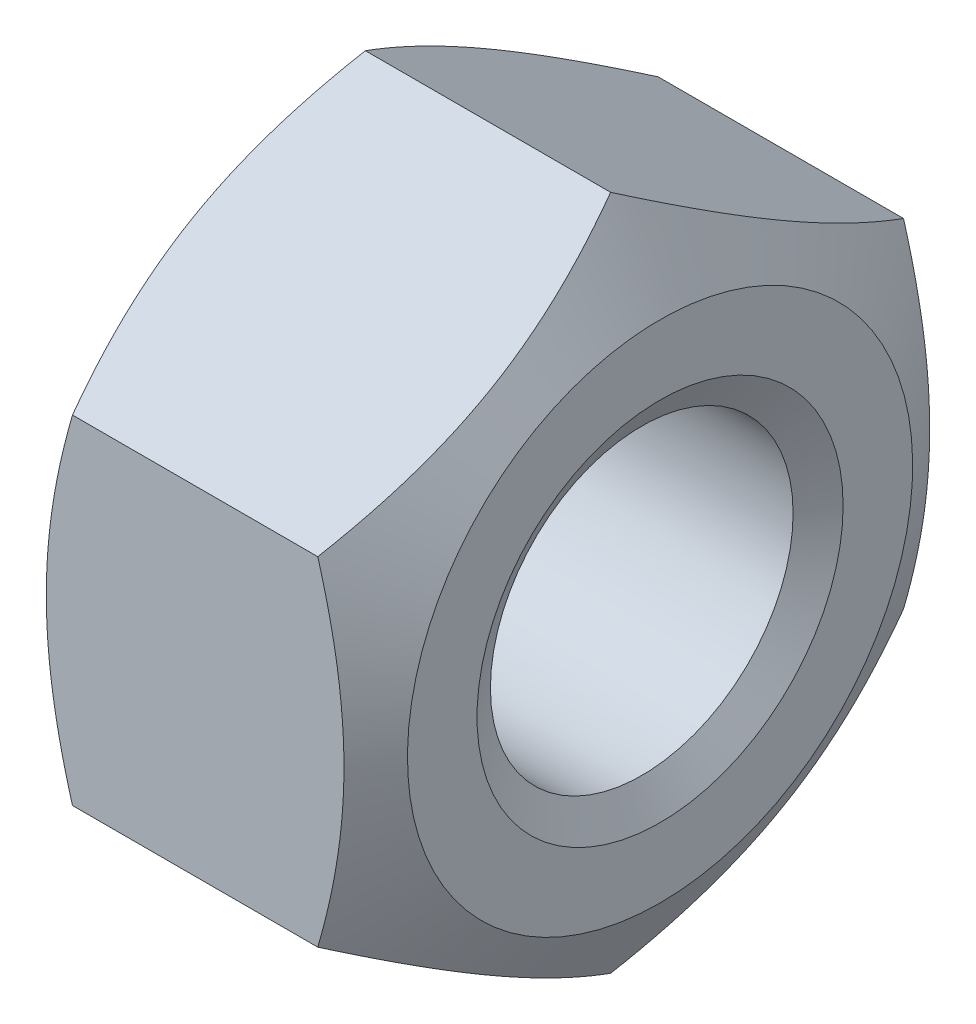
ISO-10303-21;
HEADER;
FILE_DESCRIPTION(('STEP AP214'),'2;1');
FILE_NAME('part.step','',(''),(''),'','','');
FILE_SCHEMA(('AUTOMOTIVE_DESIGN { 1 0 10303 214 1 1 1 1 }'));
ENDSEC;
DATA;
#1=APPLICATION_CONTEXT('core data for automotive mechanical design processes');
#2=APPLICATION_PROTOCOL_DEFINITION('international standard','automotive_design',2000,#1);
#3=PRODUCT_CONTEXT('',#1,'mechanical');
#4=PRODUCT('Part','Part','',(#3));
#5=PRODUCT_RELATED_PRODUCT_CATEGORY('part','',(#4));
#6=PRODUCT_DEFINITION_FORMATION('','',#4);
#7=PRODUCT_DEFINITION_CONTEXT('part definition',#1,'design');
#8=PRODUCT_DEFINITION('design','',#6,#7);
#9=PRODUCT_DEFINITION_SHAPE('','',#8);
#10=(LENGTH_UNIT() NAMED_UNIT(*) SI_UNIT(.MILLI.,.METRE.));
#11=(NAMED_UNIT(*) PLANE_ANGLE_UNIT() SI_UNIT($,.RADIAN.));
#12=(NAMED_UNIT(*) SI_UNIT($,.STERADIAN.) SOLID_ANGLE_UNIT());
#13=UNCERTAINTY_MEASURE_WITH_UNIT(LENGTH_MEASURE(1.E-05),#10,'distance_accuracy_value','');
#14=(GEOMETRIC_REPRESENTATION_CONTEXT(3) GLOBAL_UNCERTAINTY_ASSIGNED_CONTEXT((#13)) GLOBAL_UNIT_ASSIGNED_CONTEXT((#10,
#11,#12)) REPRESENTATION_CONTEXT('',''));
#15=CARTESIAN_POINT('',(0.,0.,0.));
#16=DIRECTION('',(0.,0.,1.));
#17=DIRECTION('',(1.,0.,0.));
#18=AXIS2_PLACEMENT_3D('',#15,#16,#17);
#19=CARTESIAN_POINT('',(0.,-4.61880215351701,0.));
#20=DIRECTION('',(0.,-0.866025403784439,0.5));
#21=DIRECTION('',(-1.,0.,0.));
#22=AXIS2_PLACEMENT_3D('',#19,#20,#21);
#23=PLANE('',#22);
#24=CARTESIAN_POINT('',(0.674808237962457,-2.30940107675851,4.));
#25=CARTESIAN_POINT('',(0.00814157129579357,-3.46410161513776,2.));
#26=CARTESIAN_POINT('',(0.674808237962457,-4.61880215351701,0.));
#27=(BOUNDED_CURVE() B_SPLINE_CURVE(2,(#24,#25,#26),.UNSPECIFIED.,.F.,
.F.) B_SPLINE_CURVE_WITH_KNOTS((3,3),(0.,0.467374455231166),
.UNSPECIFIED.) CURVE() GEOMETRIC_REPRESENTATION_ITEM() RATIONAL_B_SPLINE_CURVE((1.,
1.15470053837925,1.)) REPRESENTATION_ITEM(''));
#28=CARTESIAN_POINT('',(0.674808237962457,-2.3094010767585,4.));
#29=VERTEX_POINT('',#28);
#30=CARTESIAN_POINT('',(0.674808237962457,-4.61880215351701,0.));
#31=VERTEX_POINT('',#30);
#32=EDGE_CURVE('E158',#29,#31,#27,.T.);
#33=ORIENTED_EDGE('',*,*,#32,.T.);
#34=DIRECTION('',(1.,0.,0.));
#35=VECTOR('',#34,1.);
#36=CARTESIAN_POINT('',(0.,-4.61880215351701,0.));
#37=LINE('',#36,#35);
#38=CARTESIAN_POINT('',(4.02519176203754,-4.61880215351701,0.));
#39=VERTEX_POINT('',#38);
#40=EDGE_CURVE('E11',#31,#39,#37,.T.);
#41=ORIENTED_EDGE('',*,*,#40,.T.);
#42=CARTESIAN_POINT('',(4.02519176203754,-4.61880215351701,0.));
#43=CARTESIAN_POINT('',(4.69185842870421,-3.46410161513776,2.));
#44=CARTESIAN_POINT('',(4.02519176203754,-2.30940107675851,4.));
#45=(BOUNDED_CURVE() B_SPLINE_CURVE(2,(#42,#43,#44),.UNSPECIFIED.,.F.,
.F.) B_SPLINE_CURVE_WITH_KNOTS((3,3),(0.,0.467374455231167),
.UNSPECIFIED.) CURVE() GEOMETRIC_REPRESENTATION_ITEM() RATIONAL_B_SPLINE_CURVE((1.,
1.15470053837925,1.)) REPRESENTATION_ITEM(''));
#46=CARTESIAN_POINT('',(4.02519176203754,-2.3094010767585,4.));
#47=VERTEX_POINT('',#46);
#48=EDGE_CURVE('E238',#39,#47,#45,.T.);
#49=ORIENTED_EDGE('',*,*,#48,.T.);
#50=DIRECTION('',(1.,0.,0.));
#51=VECTOR('',#50,1.);
#52=CARTESIAN_POINT('',(0.,-2.3094010767585,4.));
#53=LINE('',#52,#51);
#54=EDGE_CURVE('E27',#29,#47,#53,.T.);
#55=ORIENTED_EDGE('',*,*,#54,.F.);
#56=EDGE_LOOP('',(#33,#41,#49,#55));
#57=FACE_BOUND('',#56,.T.);
#58=ADVANCED_FACE('F17',(#57),#23,.T.);
#59=CARTESIAN_POINT('',(0.,-2.30940107675849,-4.));
#60=DIRECTION('',(0.,-0.866025403784439,-0.5));
#61=DIRECTION('',(0.,0.5,-0.866025403784439));
#62=AXIS2_PLACEMENT_3D('',#59,#60,#61);
#63=PLANE('',#62);
#64=CARTESIAN_POINT('',(0.674808237962457,-4.61880215351701,0.));
#65=CARTESIAN_POINT('',(0.0081415712957876,-3.46410161513776,-2.));
#66=CARTESIAN_POINT('',(0.674808237962457,-2.3094010767585,-4.));
#67=(BOUNDED_CURVE() B_SPLINE_CURVE(2,(#64,#65,#66),.UNSPECIFIED.,.F.,
.F.) B_SPLINE_CURVE_WITH_KNOTS((3,3),(0.,0.467374455231168),
.UNSPECIFIED.) CURVE() GEOMETRIC_REPRESENTATION_ITEM() RATIONAL_B_SPLINE_CURVE((1.,
1.15470053837925,1.)) REPRESENTATION_ITEM(''));
#68=CARTESIAN_POINT('',(0.674808237962457,-2.30940107675849,-4.));
#69=VERTEX_POINT('',#68);
#70=EDGE_CURVE('E157',#31,#69,#67,.T.);
#71=ORIENTED_EDGE('',*,*,#70,.T.);
#72=DIRECTION('',(1.,0.,0.));
#73=VECTOR('',#72,1.);
#74=CARTESIAN_POINT('',(0.,-2.30940107675849,-4.));
#75=LINE('',#74,#73);
#76=CARTESIAN_POINT('',(4.02519176203754,-2.30940107675849,-4.));
#77=VERTEX_POINT('',#76);
#78=EDGE_CURVE('E254',#69,#77,#75,.T.);
#79=ORIENTED_EDGE('',*,*,#78,.T.);
#80=CARTESIAN_POINT('',(4.02519176203754,-2.30940107675849,-4.));
#81=CARTESIAN_POINT('',(4.69185842870421,-3.46410161513776,-2.));
#82=CARTESIAN_POINT('',(4.02519176203754,-4.61880215351701,0.));
#83=(BOUNDED_CURVE() B_SPLINE_CURVE(2,(#80,#81,#82),.UNSPECIFIED.,.F.,
.F.) B_SPLINE_CURVE_WITH_KNOTS((3,3),(0.,0.467374455231169),
.UNSPECIFIED.) CURVE() GEOMETRIC_REPRESENTATION_ITEM() RATIONAL_B_SPLINE_CURVE((1.,
1.15470053837925,1.)) REPRESENTATION_ITEM(''));
#84=EDGE_CURVE('E196',#77,#39,#83,.T.);
#85=ORIENTED_EDGE('',*,*,#84,.T.);
#86=ORIENTED_EDGE('',*,*,#40,.F.);
#87=EDGE_LOOP('',(#71,#79,#85,#86));
#88=FACE_BOUND('',#87,.T.);
#89=ADVANCED_FACE('F394',(#88),#63,.T.);
#90=CARTESIAN_POINT('',(0.,-2.3094010767585,4.));
#91=DIRECTION('',(0.,0.,1.));
#92=DIRECTION('',(1.,0.,0.));
#93=AXIS2_PLACEMENT_3D('',#90,#91,#92);
#94=PLANE('',#93);
#95=CARTESIAN_POINT('',(0.674808237962457,2.3094010767585,4.));
#96=CARTESIAN_POINT('',(0.00814157129579468,0.,4.));
#97=CARTESIAN_POINT('',(0.674808237962457,-2.3094010767585,4.));
#98=(BOUNDED_CURVE() B_SPLINE_CURVE(2,(#95,#96,#97),.UNSPECIFIED.,.F.,
.F.) B_SPLINE_CURVE_WITH_KNOTS((3,3),(0.,0.467374455231166),
.UNSPECIFIED.) CURVE() GEOMETRIC_REPRESENTATION_ITEM() RATIONAL_B_SPLINE_CURVE((1.,
1.15470053837925,1.)) REPRESENTATION_ITEM(''));
#99=CARTESIAN_POINT('',(0.674808237962457,2.3094010767585,4.));
#100=VERTEX_POINT('',#99);
#101=EDGE_CURVE('E153',#100,#29,#98,.T.);
#102=ORIENTED_EDGE('',*,*,#101,.T.);
#103=ORIENTED_EDGE('',*,*,#54,.T.);
#104=CARTESIAN_POINT('',(4.02519176203754,-2.3094010767585,4.));
#105=CARTESIAN_POINT('',(4.69185842870421,0.,4.));
#106=CARTESIAN_POINT('',(4.02519176203754,2.3094010767585,4.));
#107=(BOUNDED_CURVE() B_SPLINE_CURVE(2,(#104,#105,#106),.UNSPECIFIED.,.F.,
.F.) B_SPLINE_CURVE_WITH_KNOTS((3,3),(0.,0.467374455231166),
.UNSPECIFIED.) CURVE() GEOMETRIC_REPRESENTATION_ITEM() RATIONAL_B_SPLINE_CURVE((1.,
1.15470053837925,1.)) REPRESENTATION_ITEM(''));
#108=CARTESIAN_POINT('',(4.02519176203754,2.3094010767585,4.));
#109=VERTEX_POINT('',#108);
#110=EDGE_CURVE('E230',#47,#109,#107,.T.);
#111=ORIENTED_EDGE('',*,*,#110,.T.);
#112=DIRECTION('',(1.,0.,0.));
#113=VECTOR('',#112,1.);
#114=CARTESIAN_POINT('',(0.,2.3094010767585,4.));
#115=LINE('',#114,#113);
#116=EDGE_CURVE('E50',#100,#109,#115,.T.);
#117=ORIENTED_EDGE('',*,*,#116,.F.);
#118=EDGE_LOOP('',(#102,#103,#111,#117));
#119=FACE_BOUND('',#118,.T.);
#120=ADVANCED_FACE('F19',(#119),#94,.T.);
#121=CARTESIAN_POINT('',(0.,2.3094010767585,4.));
#122=DIRECTION('',(0.,0.866025403784439,0.5));
#123=DIRECTION('',(1.,0.,0.));
#124=AXIS2_PLACEMENT_3D('',#121,#122,#123);
#125=PLANE('',#124);
#126=CARTESIAN_POINT('',(0.674808237962457,4.61880215351701,0.));
#127=CARTESIAN_POINT('',(0.00814157129579232,3.46410161513776,2.));
#128=CARTESIAN_POINT('',(0.674808237962457,2.3094010767585,4.));
#129=(BOUNDED_CURVE() B_SPLINE_CURVE(2,(#126,#127,#128),.UNSPECIFIED.,.F.,
.F.) B_SPLINE_CURVE_WITH_KNOTS((3,3),(0.,0.467374455231167),
.UNSPECIFIED.) CURVE() GEOMETRIC_REPRESENTATION_ITEM() RATIONAL_B_SPLINE_CURVE((1.,
1.15470053837925,1.)) REPRESENTATION_ITEM(''));
#130=CARTESIAN_POINT('',(0.674808237962457,4.61880215351701,0.));
#131=VERTEX_POINT('',#130);
#132=EDGE_CURVE('E173',#131,#100,#129,.T.);
#133=ORIENTED_EDGE('',*,*,#132,.T.);
#134=ORIENTED_EDGE('',*,*,#116,.T.);
#135=CARTESIAN_POINT('',(4.02519176203754,2.30940107675851,4.));
#136=CARTESIAN_POINT('',(4.69185842870421,3.46410161513776,2.));
#137=CARTESIAN_POINT('',(4.02519176203754,4.61880215351701,0.));
#138=(BOUNDED_CURVE() B_SPLINE_CURVE(2,(#135,#136,#137),.UNSPECIFIED.,.F.,
.F.) B_SPLINE_CURVE_WITH_KNOTS((3,3),(0.,0.467374455231166),
.UNSPECIFIED.) CURVE() GEOMETRIC_REPRESENTATION_ITEM() RATIONAL_B_SPLINE_CURVE((1.,
1.15470053837925,1.)) REPRESENTATION_ITEM(''));
#139=CARTESIAN_POINT('',(4.02519176203754,4.61880215351701,0.));
#140=VERTEX_POINT('',#139);
#141=EDGE_CURVE('E225',#109,#140,#138,.T.);
#142=ORIENTED_EDGE('',*,*,#141,.T.);
#143=DIRECTION('',(1.,0.,0.));
#144=VECTOR('',#143,1.);
#145=CARTESIAN_POINT('',(0.,4.61880215351701,0.));
#146=LINE('',#145,#144);
#147=EDGE_CURVE('E246',#131,#140,#146,.T.);
#148=ORIENTED_EDGE('',*,*,#147,.F.);
#149=EDGE_LOOP('',(#133,#134,#142,#148));
#150=FACE_BOUND('',#149,.T.);
#151=ADVANCED_FACE('F399',(#150),#125,.T.);
#152=CARTESIAN_POINT('',(0.,2.30940107675851,-4.));
#153=DIRECTION('',(0.,0.,-1.));
#154=DIRECTION('',(-1.,0.,0.));
#155=AXIS2_PLACEMENT_3D('',#152,#153,#154);
#156=PLANE('',#155);
#157=CARTESIAN_POINT('',(0.674808237962457,-2.30940107675849,-4.));
#158=CARTESIAN_POINT('',(0.00814157129579204,0.,-4.));
#159=CARTESIAN_POINT('',(0.674808237962457,2.30940107675851,-4.));
#160=(BOUNDED_CURVE() B_SPLINE_CURVE(2,(#157,#158,#159),.UNSPECIFIED.,.F.,
.F.) B_SPLINE_CURVE_WITH_KNOTS((3,3),(0.,0.467374455231167),
.UNSPECIFIED.) CURVE() GEOMETRIC_REPRESENTATION_ITEM() RATIONAL_B_SPLINE_CURVE((1.,
1.15470053837925,1.)) REPRESENTATION_ITEM(''));
#161=CARTESIAN_POINT('',(0.674808237962457,2.30940107675851,-4.));
#162=VERTEX_POINT('',#161);
#163=EDGE_CURVE('E167',#69,#162,#160,.T.);
#164=ORIENTED_EDGE('',*,*,#163,.T.);
#165=DIRECTION('',(1.,0.,0.));
#166=VECTOR('',#165,1.);
#167=CARTESIAN_POINT('',(0.,2.30940107675851,-4.));
#168=LINE('',#167,#166);
#169=CARTESIAN_POINT('',(4.02519176203754,2.30940107675851,-4.));
#170=VERTEX_POINT('',#169);
#171=EDGE_CURVE('E252',#162,#170,#168,.T.);
#172=ORIENTED_EDGE('',*,*,#171,.T.);
#173=CARTESIAN_POINT('',(4.02519176203754,2.30940107675851,-4.));
#174=CARTESIAN_POINT('',(4.69185842870421,0.,-4.));
#175=CARTESIAN_POINT('',(4.02519176203754,-2.3094010767585,-4.));
#176=(BOUNDED_CURVE() B_SPLINE_CURVE(2,(#173,#174,#175),.UNSPECIFIED.,.F.,
.F.) B_SPLINE_CURVE_WITH_KNOTS((3,3),(0.,0.467374455231167),
.UNSPECIFIED.) CURVE() GEOMETRIC_REPRESENTATION_ITEM() RATIONAL_B_SPLINE_CURVE((1.,
1.15470053837925,1.)) REPRESENTATION_ITEM(''));
#177=EDGE_CURVE('E204',#170,#77,#176,.T.);
#178=ORIENTED_EDGE('',*,*,#177,.T.);
#179=ORIENTED_EDGE('',*,*,#78,.F.);
#180=EDGE_LOOP('',(#164,#172,#178,#179));
#181=FACE_BOUND('',#180,.T.);
#182=ADVANCED_FACE('F406',(#181),#156,.T.);
#183=CARTESIAN_POINT('',(0.,4.61880215351701,0.));
#184=DIRECTION('',(0.,0.866025403784439,-0.5));
#185=DIRECTION('',(-1.,0.,0.));
#186=AXIS2_PLACEMENT_3D('',#183,#184,#185);
#187=PLANE('',#186);
#188=CARTESIAN_POINT('',(0.674808237962457,2.30940107675851,-4.));
#189=CARTESIAN_POINT('',(0.00814157129579191,3.46410161513776,-1.99999999999999));
#190=CARTESIAN_POINT('',(0.674808237962457,4.61880215351701,0.));
#191=(BOUNDED_CURVE() B_SPLINE_CURVE(2,(#188,#189,#190),.UNSPECIFIED.,.F.,
.F.) B_SPLINE_CURVE_WITH_KNOTS((3,3),(0.,0.467374455231167),
.UNSPECIFIED.) CURVE() GEOMETRIC_REPRESENTATION_ITEM() RATIONAL_B_SPLINE_CURVE((1.,
1.15470053837925,1.)) REPRESENTATION_ITEM(''));
#192=EDGE_CURVE('E181',#162,#131,#191,.T.);
#193=ORIENTED_EDGE('',*,*,#192,.T.);
#194=ORIENTED_EDGE('',*,*,#147,.T.);
#195=CARTESIAN_POINT('',(4.02519176203754,4.61880215351701,0.));
#196=CARTESIAN_POINT('',(4.69185842870421,3.46410161513776,-2.));
#197=CARTESIAN_POINT('',(4.02519176203754,2.30940107675851,-4.));
#198=(BOUNDED_CURVE() B_SPLINE_CURVE(2,(#195,#196,#197),.UNSPECIFIED.,.F.,
.F.) B_SPLINE_CURVE_WITH_KNOTS((3,3),(0.,0.467374455231167),
.UNSPECIFIED.) CURVE() GEOMETRIC_REPRESENTATION_ITEM() RATIONAL_B_SPLINE_CURVE((1.,
1.15470053837925,1.)) REPRESENTATION_ITEM(''));
#199=EDGE_CURVE('E213',#140,#170,#198,.T.);
#200=ORIENTED_EDGE('',*,*,#199,.T.);
#201=ORIENTED_EDGE('',*,*,#171,.F.);
#202=EDGE_LOOP('',(#193,#194,#200,#201));
#203=FACE_BOUND('',#202,.T.);
#204=ADVANCED_FACE('F401',(#203),#187,.T.);
#205=CARTESIAN_POINT('',(4.36259588101877,0.,0.));
#206=DIRECTION('',(-1.,0.,0.));
#207=DIRECTION('',(0.,1.,0.));
#208=AXIS2_PLACEMENT_3D('',#205,#206,#207);
#209=CONICAL_SURFACE('',#208,4.0344010767585,1.0471975511966);
#210=CARTESIAN_POINT('',(4.7,0.,0.));
#211=DIRECTION('',(1.,0.,0.));
#212=DIRECTION('',(0.,1.,0.));
#213=AXIS2_PLACEMENT_3D('',#210,#211,#212);
#214=CIRCLE('',#213,3.45);
#215=CARTESIAN_POINT('',(4.7,-3.45,0.));
#216=VERTEX_POINT('',#215);
#217=EDGE_CURVE('E122',#216,#216,#214,.T.);
#218=ORIENTED_EDGE('',*,*,#217,.F.);
#219=DIRECTION('',(-0.5,-0.866025403784439,0.));
#220=VECTOR('',#219,1.);
#221=CARTESIAN_POINT('',(4.36259588101877,-4.0344010767585,0.));
#222=LINE('',#221,#220);
#223=EDGE_CURVE('E191',#216,#39,#222,.T.);
#224=ORIENTED_EDGE('',*,*,#223,.T.);
#225=ORIENTED_EDGE('',*,*,#84,.F.);
#226=ORIENTED_EDGE('',*,*,#177,.F.);
#227=ORIENTED_EDGE('',*,*,#199,.F.);
#228=ORIENTED_EDGE('',*,*,#141,.F.);
#229=ORIENTED_EDGE('',*,*,#110,.F.);
#230=ORIENTED_EDGE('',*,*,#48,.F.);
#231=ORIENTED_EDGE('',*,*,#223,.F.);
#232=EDGE_LOOP('',(#218,#224,#225,#226,#227,#228,#229,#230,#231));
#233=FACE_BOUND('',#232,.T.);
#234=ADVANCED_FACE('F408',(#233),#209,.T.);
#235=CARTESIAN_POINT('',(0.337404118981229,0.,0.));
#236=DIRECTION('',(1.,0.,0.));
#237=DIRECTION('',(0.,1.,0.));
#238=AXIS2_PLACEMENT_3D('',#235,#236,#237);
#239=CONICAL_SURFACE('',#238,4.0344010767585,1.0471975511966);
#240=ORIENTED_EDGE('',*,*,#101,.F.);
#241=ORIENTED_EDGE('',*,*,#132,.F.);
#242=ORIENTED_EDGE('',*,*,#192,.F.);
#243=ORIENTED_EDGE('',*,*,#163,.F.);
#244=ORIENTED_EDGE('',*,*,#70,.F.);
#245=DIRECTION('',(-0.5,0.866025403784439,0.));
#246=VECTOR('',#245,1.);
#247=CARTESIAN_POINT('',(0.337404118981229,-4.0344010767585,0.));
#248=LINE('',#247,#246);
#249=CARTESIAN_POINT('',(0.,-3.45,0.));
#250=VERTEX_POINT('',#249);
#251=EDGE_CURVE('E156',#31,#250,#248,.T.);
#252=ORIENTED_EDGE('',*,*,#251,.T.);
#253=CARTESIAN_POINT('',(0.,0.,0.));
#254=DIRECTION('',(-1.,0.,0.));
#255=DIRECTION('',(0.,1.,0.));
#256=AXIS2_PLACEMENT_3D('',#253,#254,#255);
#257=CIRCLE('',#256,3.45);
#258=EDGE_CURVE('E148',#250,#250,#257,.T.);
#259=ORIENTED_EDGE('',*,*,#258,.F.);
#260=ORIENTED_EDGE('',*,*,#251,.F.);
#261=ORIENTED_EDGE('',*,*,#32,.F.);
#262=EDGE_LOOP('',(#240,#241,#242,#243,#244,#252,#259,#260,#261));
#263=FACE_BOUND('',#262,.T.);
#264=ADVANCED_FACE('F390',(#263),#239,.T.);
#265=CARTESIAN_POINT('',(4.7,0.,0.));
#266=DIRECTION('',(1.,0.,0.));
#267=DIRECTION('',(0.,1.,0.));
#268=AXIS2_PLACEMENT_3D('',#265,#266,#267);
#269=PLANE('',#268);
#270=CARTESIAN_POINT('',(4.7,0.,0.));
#271=DIRECTION('',(1.,0.,0.));
#272=DIRECTION('',(0.,0.,1.));
#273=AXIS2_PLACEMENT_3D('',#270,#271,#272);
#274=CIRCLE('',#273,2.50001270189222);
#275=CARTESIAN_POINT('',(4.7,0.,-2.50001270189222));
#276=VERTEX_POINT('',#275);
#277=EDGE_CURVE('E125',#276,#276,#274,.T.);
#278=ORIENTED_EDGE('',*,*,#277,.F.);
#279=EDGE_LOOP('',(#278));
#280=FACE_BOUND('',#279,.T.);
#281=ORIENTED_EDGE('',*,*,#217,.T.);
#282=EDGE_LOOP('',(#281));
#283=FACE_BOUND('',#282,.T.);
#284=ADVANCED_FACE('F411',(#280,#283),#269,.T.);
#285=CARTESIAN_POINT('',(4.575,0.,0.));
#286=DIRECTION('',(1.,0.,0.));
#287=DIRECTION('',(0.,0.,1.));
#288=AXIS2_PLACEMENT_3D('',#285,#286,#287);
#289=CONICAL_SURFACE('',#288,2.28350635094611,1.0471975511966);
#290=ORIENTED_EDGE('',*,*,#277,.T.);
#291=DIRECTION('',(-0.5,0.,0.866025403784439));
#292=VECTOR('',#291,1.);
#293=CARTESIAN_POINT('',(4.575,0.,-2.28350635094611));
#294=LINE('',#293,#292);
#295=CARTESIAN_POINT('',(4.45,0.,-2.067));
#296=VERTEX_POINT('',#295);
#297=EDGE_CURVE('E116',#276,#296,#294,.T.);
#298=ORIENTED_EDGE('',*,*,#297,.T.);
#299=CARTESIAN_POINT('',(4.45,0.,0.));
#300=DIRECTION('',(-1.,0.,0.));
#301=DIRECTION('',(0.,0.,1.));
#302=AXIS2_PLACEMENT_3D('',#299,#300,#301);
#303=CIRCLE('',#302,2.067);
#304=CARTESIAN_POINT('',(4.45,0.,2.067));
#305=VERTEX_POINT('',#304);
#306=EDGE_CURVE('E120',#296,#305,#303,.T.);
#307=ORIENTED_EDGE('',*,*,#306,.T.);
#308=CARTESIAN_POINT('',(4.45,0.,0.));
#309=DIRECTION('',(-1.,0.,0.));
#310=DIRECTION('',(0.,0.,1.));
#311=AXIS2_PLACEMENT_3D('',#308,#309,#310);
#312=CIRCLE('',#311,2.067);
#313=EDGE_CURVE('E126',#305,#296,#312,.T.);
#314=ORIENTED_EDGE('',*,*,#313,.T.);
#315=ORIENTED_EDGE('',*,*,#297,.F.);
#316=EDGE_LOOP('',(#290,#298,#307,#314,#315));
#317=FACE_BOUND('',#316,.T.);
#318=ADVANCED_FACE('F119',(#317),#289,.F.);
#319=CARTESIAN_POINT('',(0.,0.,0.));
#320=DIRECTION('',(1.,0.,0.));
#321=DIRECTION('',(0.,1.,0.));
#322=AXIS2_PLACEMENT_3D('',#319,#320,#321);
#323=PLANE('',#322);
#324=CARTESIAN_POINT('',(0.,0.,0.));
#325=DIRECTION('',(-1.,0.,0.));
#326=DIRECTION('',(0.,0.,-1.));
#327=AXIS2_PLACEMENT_3D('',#324,#325,#326);
#328=CIRCLE('',#327,2.50001270189222);
#329=CARTESIAN_POINT('',(0.,0.,2.50001270189222));
#330=VERTEX_POINT('',#329);
#331=EDGE_CURVE('E358',#330,#330,#328,.T.);
#332=ORIENTED_EDGE('',*,*,#331,.F.);
#333=EDGE_LOOP('',(#332));
#334=FACE_BOUND('',#333,.T.);
#335=ORIENTED_EDGE('',*,*,#258,.T.);
#336=EDGE_LOOP('',(#335));
#337=FACE_BOUND('',#336,.T.);
#338=ADVANCED_FACE('F377',(#334,#337),#323,.F.);
#339=CARTESIAN_POINT('',(-8.39287337956545,0.,0.));
#340=DIRECTION('',(1.,0.,0.));
#341=DIRECTION('',(0.,0.,-1.));
#342=AXIS2_PLACEMENT_3D('',#339,#340,#341);
#343=CYLINDRICAL_SURFACE('',#342,2.067);
#344=ORIENTED_EDGE('',*,*,#306,.F.);
#345=ORIENTED_EDGE('',*,*,#313,.F.);
#346=DIRECTION('',(-1.,0.,0.));
#347=VECTOR('',#346,1.);
#348=CARTESIAN_POINT('',(-8.39287337956545,0.,2.067));
#349=LINE('',#348,#347);
#350=CARTESIAN_POINT('',(0.25,0.,2.067));
#351=VERTEX_POINT('',#350);
#352=EDGE_CURVE('E129',#305,#351,#349,.T.);
#353=ORIENTED_EDGE('',*,*,#352,.T.);
#354=CARTESIAN_POINT('',(0.25,0.,0.));
#355=DIRECTION('',(1.,0.,0.));
#356=DIRECTION('',(0.,0.,-1.));
#357=AXIS2_PLACEMENT_3D('',#354,#355,#356);
#358=CIRCLE('',#357,2.067);
#359=EDGE_CURVE('E134',#351,#351,#358,.T.);
#360=ORIENTED_EDGE('',*,*,#359,.F.);
#361=ORIENTED_EDGE('',*,*,#352,.F.);
#362=EDGE_LOOP('',(#344,#345,#353,#360,#361));
#363=FACE_BOUND('',#362,.T.);
#364=ADVANCED_FACE('F135',(#363),#343,.F.);
#365=CARTESIAN_POINT('',(0.125,0.,0.));
#366=DIRECTION('',(-1.,0.,0.));
#367=DIRECTION('',(0.,0.,-1.));
#368=AXIS2_PLACEMENT_3D('',#365,#366,#367);
#369=CONICAL_SURFACE('',#368,2.28350635094611,1.0471975511966);
#370=ORIENTED_EDGE('',*,*,#331,.T.);
#371=DIRECTION('',(0.5,0.,-0.866025403784439));
#372=VECTOR('',#371,1.);
#373=CARTESIAN_POINT('',(0.125,0.,2.28350635094611));
#374=LINE('',#373,#372);
#375=EDGE_CURVE('E142',#330,#351,#374,.T.);
#376=ORIENTED_EDGE('',*,*,#375,.T.);
#377=ORIENTED_EDGE('',*,*,#359,.T.);
#378=ORIENTED_EDGE('',*,*,#375,.F.);
#379=EDGE_LOOP('',(#370,#376,#377,#378));
#380=FACE_BOUND('',#379,.T.);
#381=ADVANCED_FACE('F380',(#380),#369,.F.);
#382=CLOSED_SHELL('',(#58,#89,#120,#151,#182,#204,#234,#264,#284,#318,#338,#364,#381));
#383=MANIFOLD_SOLID_BREP('B1',#382);
#384=ADVANCED_BREP_SHAPE_REPRESENTATION('',(#18,#383),#14);
#385=SHAPE_DEFINITION_REPRESENTATION(#9,#384);
ENDSEC;
END-ISO-10303-21;
